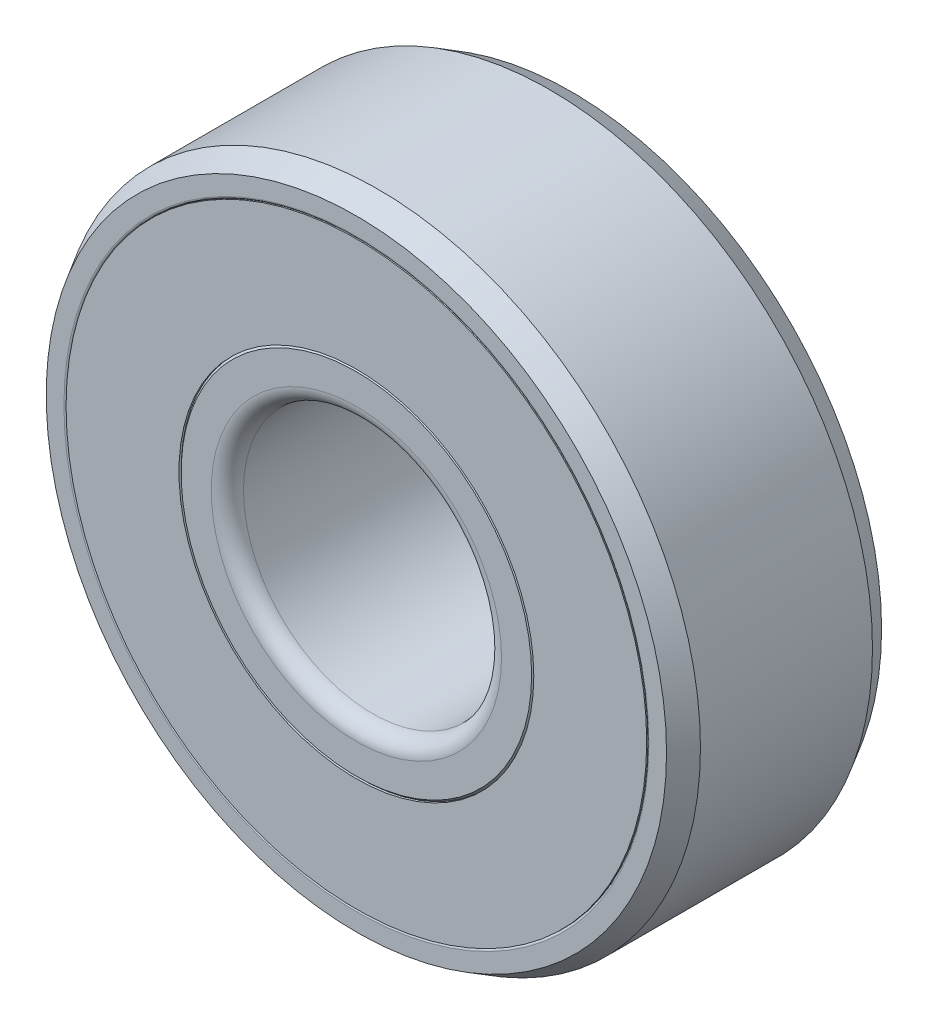
ISO-10303-21;
HEADER;
FILE_DESCRIPTION(('STEP AP214'),'2;1');
FILE_NAME('part.step','',(''),(''),'','','');
FILE_SCHEMA(('AUTOMOTIVE_DESIGN { 1 0 10303 214 1 1 1 1 }'));
ENDSEC;
DATA;
#1=APPLICATION_CONTEXT('core data for automotive mechanical design processes');
#2=APPLICATION_PROTOCOL_DEFINITION('international standard','automotive_design',2000,#1);
#3=PRODUCT_CONTEXT('',#1,'mechanical');
#4=PRODUCT('Part','Part','',(#3));
#5=PRODUCT_RELATED_PRODUCT_CATEGORY('part','',(#4));
#6=PRODUCT_DEFINITION_FORMATION('','',#4);
#7=PRODUCT_DEFINITION_CONTEXT('part definition',#1,'design');
#8=PRODUCT_DEFINITION('design','',#6,#7);
#9=PRODUCT_DEFINITION_SHAPE('','',#8);
#10=(LENGTH_UNIT() NAMED_UNIT(*) SI_UNIT(.MILLI.,.METRE.));
#11=(NAMED_UNIT(*) PLANE_ANGLE_UNIT() SI_UNIT($,.RADIAN.));
#12=(NAMED_UNIT(*) SI_UNIT($,.STERADIAN.) SOLID_ANGLE_UNIT());
#13=UNCERTAINTY_MEASURE_WITH_UNIT(LENGTH_MEASURE(1.E-05),#10,'distance_accuracy_value','');
#14=(GEOMETRIC_REPRESENTATION_CONTEXT(3) GLOBAL_UNCERTAINTY_ASSIGNED_CONTEXT((#13)) GLOBAL_UNIT_ASSIGNED_CONTEXT((#10,
#11,#12)) REPRESENTATION_CONTEXT('',''));
#15=CARTESIAN_POINT('',(0.,0.,0.));
#16=DIRECTION('',(0.,0.,1.));
#17=DIRECTION('',(1.,0.,0.));
#18=AXIS2_PLACEMENT_3D('',#15,#16,#17);
#19=CARTESIAN_POINT('',(4.25120868591987,-3.39022579760692,0.));
#20=DIRECTION('',(-0.781831482468022,0.623489801858743,0.));
#21=DIRECTION('',(0.,0.,-1.));
#22=AXIS2_PLACEMENT_3D('',#19,#20,#21);
#23=SPHERICAL_SURFACE('',#22,1.8125);
#24=CARTESIAN_POINT('',(2.83413912394658,-2.26015053173794,0.));
#25=VERTEX_POINT('',#24);
#26=VERTEX_LOOP('',#25);
#27=FACE_BOUND('',#26,.T.);
#28=ADVANCED_FACE('F42',(#27),#23,.T.);
#29=CLOSED_SHELL('',(#28));
#30=MANIFOLD_SOLID_BREP('B2',#29);
#31=CARTESIAN_POINT('',(5.30117052248868,1.20995757838741,0.));
#32=DIRECTION('',(-0.974927912181826,-0.222520933956305,0.));
#33=DIRECTION('',(0.,0.,-1.));
#34=AXIS2_PLACEMENT_3D('',#31,#32,#33);
#35=SPHERICAL_SURFACE('',#34,1.8125);
#36=CARTESIAN_POINT('',(3.53411368165912,0.806638385591606,0.));
#37=VERTEX_POINT('',#36);
#38=VERTEX_LOOP('',#37);
#39=FACE_BOUND('',#38,.T.);
#40=ADVANCED_FACE('F63',(#39),#35,.T.);
#41=CLOSED_SHELL('',(#40));
#42=MANIFOLD_SOLID_BREP('B6',#41);
#43=CARTESIAN_POINT('',(2.35924283145176,4.89901821921939,0.));
#44=DIRECTION('',(-0.433883739117565,-0.900968867902416,0.));
#45=DIRECTION('',(0.,0.,-1.));
#46=AXIS2_PLACEMENT_3D('',#43,#44,#45);
#47=SPHERICAL_SURFACE('',#46,1.8125);
#48=CARTESIAN_POINT('',(1.57282855430117,3.26601214614626,0.));
#49=VERTEX_POINT('',#48);
#50=VERTEX_LOOP('',#49);
#51=FACE_BOUND('',#50,.T.);
#52=ADVANCED_FACE('F84',(#51),#47,.T.);
#53=CLOSED_SHELL('',(#52));
#54=MANIFOLD_SOLID_BREP('B38',#53);
#55=CARTESIAN_POINT('',(-2.35924283145169,4.89901821921942,0.));
#56=DIRECTION('',(0.433883739117553,-0.900968867902422,0.));
#57=DIRECTION('',(0.,0.,-1.));
#58=AXIS2_PLACEMENT_3D('',#55,#56,#57);
#59=SPHERICAL_SURFACE('',#58,1.8125);
#60=CARTESIAN_POINT('',(-1.57282855430113,3.26601214614628,0.));
#61=VERTEX_POINT('',#60);
#62=VERTEX_LOOP('',#61);
#63=FACE_BOUND('',#62,.T.);
#64=ADVANCED_FACE('F105',(#63),#59,.T.);
#65=CLOSED_SHELL('',(#64));
#66=MANIFOLD_SOLID_BREP('B59',#65);
#67=CARTESIAN_POINT('',(-5.30117052248866,1.20995757838748,0.));
#68=DIRECTION('',(0.974927912181823,-0.222520933956318,0.));
#69=DIRECTION('',(0.,0.,-1.));
#70=AXIS2_PLACEMENT_3D('',#67,#68,#69);
#71=SPHERICAL_SURFACE('',#70,1.8125);
#72=CARTESIAN_POINT('',(-3.53411368165911,0.806638385591654,0.));
#73=VERTEX_POINT('',#72);
#74=VERTEX_LOOP('',#73);
#75=FACE_BOUND('',#74,.T.);
#76=ADVANCED_FACE('F126',(#75),#71,.T.);
#77=CLOSED_SHELL('',(#76));
#78=MANIFOLD_SOLID_BREP('B80',#77);
#79=CARTESIAN_POINT('',(-4.25120868591992,-3.39022579760686,0.));
#80=DIRECTION('',(0.781831482468031,0.623489801858732,0.));
#81=DIRECTION('',(0.,0.,-1.));
#82=AXIS2_PLACEMENT_3D('',#79,#80,#81);
#83=SPHERICAL_SURFACE('',#82,1.8125);
#84=CARTESIAN_POINT('',(-2.83413912394661,-2.2601505317379,0.));
#85=VERTEX_POINT('',#84);
#86=VERTEX_LOOP('',#85);
#87=FACE_BOUND('',#86,.T.);
#88=ADVANCED_FACE('F147',(#87),#83,.T.);
#89=CLOSED_SHELL('',(#88));
#90=MANIFOLD_SOLID_BREP('B101',#89);
#91=CARTESIAN_POINT('',(0.,-5.4375,0.));
#92=DIRECTION('',(0.,1.,0.));
#93=DIRECTION('',(0.,0.,-1.));
#94=AXIS2_PLACEMENT_3D('',#91,#92,#93);
#95=SPHERICAL_SURFACE('',#94,1.8125);
#96=CARTESIAN_POINT('',(0.,-3.625,0.));
#97=VERTEX_POINT('',#96);
#98=VERTEX_LOOP('',#97);
#99=FACE_BOUND('',#98,.T.);
#100=ADVANCED_FACE('F170',(#99),#95,.T.);
#101=CLOSED_SHELL('',(#100));
#102=MANIFOLD_SOLID_BREP('B122',#101);
#103=CARTESIAN_POINT('',(0.,-4.125,2.5));
#104=DIRECTION('',(0.,0.,1.));
#105=DIRECTION('',(1.,0.,0.));
#106=AXIS2_PLACEMENT_3D('',#103,#104,#105);
#107=PLANE('',#106);
#108=CARTESIAN_POINT('',(0.,0.,2.5));
#109=DIRECTION('',(0.,0.,1.));
#110=DIRECTION('',(1.,0.,0.));
#111=AXIS2_PLACEMENT_3D('',#108,#109,#110);
#112=CIRCLE('',#111,6.75);
#113=CARTESIAN_POINT('',(6.75,0.,2.5));
#114=VERTEX_POINT('',#113);
#115=EDGE_CURVE('E169',#114,#114,#112,.T.);
#116=ORIENTED_EDGE('',*,*,#115,.T.);
#117=EDGE_LOOP('',(#116));
#118=FACE_BOUND('',#117,.T.);
#119=CARTESIAN_POINT('',(0.,0.,2.5));
#120=DIRECTION('',(0.,0.,1.));
#121=DIRECTION('',(1.,0.,0.));
#122=AXIS2_PLACEMENT_3D('',#119,#120,#121);
#123=CIRCLE('',#122,4.125);
#124=CARTESIAN_POINT('',(4.125,0.,2.5));
#125=VERTEX_POINT('',#124);
#126=EDGE_CURVE('E207',#125,#125,#123,.T.);
#127=ORIENTED_EDGE('',*,*,#126,.F.);
#128=EDGE_LOOP('',(#127));
#129=FACE_BOUND('',#128,.T.);
#130=ADVANCED_FACE('F193',(#118,#129),#107,.T.);
#131=CARTESIAN_POINT('',(0.,0.,2.5));
#132=DIRECTION('',(0.,0.,1.));
#133=DIRECTION('',(1.,0.,0.));
#134=AXIS2_PLACEMENT_3D('',#131,#132,#133);
#135=CYLINDRICAL_SURFACE('',#134,6.75);
#136=CARTESIAN_POINT('',(0.,0.,1.984375));
#137=DIRECTION('',(0.,0.,1.));
#138=DIRECTION('',(1.,0.,0.));
#139=AXIS2_PLACEMENT_3D('',#136,#137,#138);
#140=CIRCLE('',#139,6.75);
#141=CARTESIAN_POINT('',(6.75,0.,1.984375));
#142=VERTEX_POINT('',#141);
#143=EDGE_CURVE('E199',#142,#142,#140,.T.);
#144=ORIENTED_EDGE('',*,*,#143,.T.);
#145=EDGE_LOOP('',(#144));
#146=FACE_BOUND('',#145,.T.);
#147=ORIENTED_EDGE('',*,*,#115,.F.);
#148=EDGE_LOOP('',(#147));
#149=FACE_BOUND('',#148,.T.);
#150=ADVANCED_FACE('F217',(#146,#149),#135,.T.);
#151=CARTESIAN_POINT('',(0.,-4.125,1.984375));
#152=DIRECTION('',(0.,0.,-1.));
#153=DIRECTION('',(-1.,0.,0.));
#154=AXIS2_PLACEMENT_3D('',#151,#152,#153);
#155=PLANE('',#154);
#156=CARTESIAN_POINT('',(0.,0.,1.984375));
#157=DIRECTION('',(0.,0.,1.));
#158=DIRECTION('',(1.,0.,0.));
#159=AXIS2_PLACEMENT_3D('',#156,#157,#158);
#160=CIRCLE('',#159,4.125);
#161=CARTESIAN_POINT('',(4.125,0.,1.984375));
#162=VERTEX_POINT('',#161);
#163=EDGE_CURVE('E203',#162,#162,#160,.T.);
#164=ORIENTED_EDGE('',*,*,#163,.T.);
#165=EDGE_LOOP('',(#164));
#166=FACE_BOUND('',#165,.T.);
#167=ORIENTED_EDGE('',*,*,#143,.F.);
#168=EDGE_LOOP('',(#167));
#169=FACE_BOUND('',#168,.T.);
#170=ADVANCED_FACE('F221',(#166,#169),#155,.T.);
#171=CARTESIAN_POINT('',(0.,0.,2.5));
#172=DIRECTION('',(0.,0.,1.));
#173=DIRECTION('',(1.,0.,0.));
#174=AXIS2_PLACEMENT_3D('',#171,#172,#173);
#175=CYLINDRICAL_SURFACE('',#174,4.125);
#176=ORIENTED_EDGE('',*,*,#126,.T.);
#177=EDGE_LOOP('',(#176));
#178=FACE_BOUND('',#177,.T.);
#179=ORIENTED_EDGE('',*,*,#163,.F.);
#180=EDGE_LOOP('',(#179));
#181=FACE_BOUND('',#180,.T.);
#182=ADVANCED_FACE('F213',(#178,#181),#175,.F.);
#183=CLOSED_SHELL('',(#130,#150,#170,#182));
#184=MANIFOLD_SOLID_BREP('B143',#183);
#185=CARTESIAN_POINT('',(0.,0.,2.125));
#186=DIRECTION('',(0.,0.,1.));
#187=DIRECTION('',(1.,0.,0.));
#188=AXIS2_PLACEMENT_3D('',#185,#186,#187);
#189=TOROIDAL_SURFACE('',#188,3.375,0.375);
#190=CARTESIAN_POINT('',(0.,0.,2.5));
#191=DIRECTION('',(0.,0.,1.));
#192=DIRECTION('',(1.,0.,0.));
#193=AXIS2_PLACEMENT_3D('',#190,#191,#192);
#194=CIRCLE('',#193,3.375);
#195=CARTESIAN_POINT('',(3.375,0.,2.5));
#196=VERTEX_POINT('',#195);
#197=EDGE_CURVE('E192',#196,#196,#194,.T.);
#198=ORIENTED_EDGE('',*,*,#197,.T.);
#199=EDGE_LOOP('',(#198));
#200=FACE_BOUND('',#199,.T.);
#201=CARTESIAN_POINT('',(0.,0.,2.125));
#202=DIRECTION('',(0.,0.,1.));
#203=DIRECTION('',(1.,0.,0.));
#204=AXIS2_PLACEMENT_3D('',#201,#202,#203);
#205=CIRCLE('',#204,3.);
#206=CARTESIAN_POINT('',(3.,0.,2.125));
#207=VERTEX_POINT('',#206);
#208=EDGE_CURVE('E298',#207,#207,#205,.T.);
#209=ORIENTED_EDGE('',*,*,#208,.F.);
#210=EDGE_LOOP('',(#209));
#211=FACE_BOUND('',#210,.T.);
#212=ADVANCED_FACE('F264',(#200,#211),#189,.T.);
#213=CARTESIAN_POINT('',(0.,-4.075,2.5));
#214=DIRECTION('',(0.,0.,1.));
#215=DIRECTION('',(1.,0.,0.));
#216=AXIS2_PLACEMENT_3D('',#213,#214,#215);
#217=PLANE('',#216);
#218=CARTESIAN_POINT('',(0.,0.,2.5));
#219=DIRECTION('',(0.,0.,1.));
#220=DIRECTION('',(1.,0.,0.));
#221=AXIS2_PLACEMENT_3D('',#218,#219,#220);
#222=CIRCLE('',#221,4.075);
#223=CARTESIAN_POINT('',(4.075,0.,2.5));
#224=VERTEX_POINT('',#223);
#225=EDGE_CURVE('E270',#224,#224,#222,.T.);
#226=ORIENTED_EDGE('',*,*,#225,.T.);
#227=EDGE_LOOP('',(#226));
#228=FACE_BOUND('',#227,.T.);
#229=ORIENTED_EDGE('',*,*,#197,.F.);
#230=EDGE_LOOP('',(#229));
#231=FACE_BOUND('',#230,.T.);
#232=ADVANCED_FACE('F306',(#228,#231),#217,.T.);
#233=CARTESIAN_POINT('',(0.,0.,2.5));
#234=DIRECTION('',(0.,0.,-1.));
#235=DIRECTION('',(-1.,0.,0.));
#236=AXIS2_PLACEMENT_3D('',#233,#234,#235);
#237=CONICAL_SURFACE('',#236,4.075,0.785398163397453);
#238=CARTESIAN_POINT('',(0.,0.,2.45));
#239=DIRECTION('',(0.,0.,1.));
#240=DIRECTION('',(1.,0.,0.));
#241=AXIS2_PLACEMENT_3D('',#238,#239,#240);
#242=CIRCLE('',#241,4.125);
#243=CARTESIAN_POINT('',(4.125,0.,2.45));
#244=VERTEX_POINT('',#243);
#245=EDGE_CURVE('E274',#244,#244,#242,.T.);
#246=ORIENTED_EDGE('',*,*,#245,.T.);
#247=EDGE_LOOP('',(#246));
#248=FACE_BOUND('',#247,.T.);
#249=ORIENTED_EDGE('',*,*,#225,.F.);
#250=EDGE_LOOP('',(#249));
#251=FACE_BOUND('',#250,.T.);
#252=ADVANCED_FACE('F310',(#248,#251),#237,.T.);
#253=CARTESIAN_POINT('',(0.,0.,2.5));
#254=DIRECTION('',(0.,0.,1.));
#255=DIRECTION('',(1.,0.,0.));
#256=AXIS2_PLACEMENT_3D('',#253,#254,#255);
#257=CYLINDRICAL_SURFACE('',#256,4.125);
#258=CARTESIAN_POINT('',(0.,0.,1.25));
#259=DIRECTION('',(0.,0.,1.));
#260=DIRECTION('',(1.,0.,0.));
#261=AXIS2_PLACEMENT_3D('',#258,#259,#260);
#262=CIRCLE('',#261,4.125);
#263=CARTESIAN_POINT('',(4.125,0.,1.25));
#264=VERTEX_POINT('',#263);
#265=EDGE_CURVE('E278',#264,#264,#262,.T.);
#266=ORIENTED_EDGE('',*,*,#265,.T.);
#267=EDGE_LOOP('',(#266));
#268=FACE_BOUND('',#267,.T.);
#269=ORIENTED_EDGE('',*,*,#245,.F.);
#270=EDGE_LOOP('',(#269));
#271=FACE_BOUND('',#270,.T.);
#272=ADVANCED_FACE('F314',(#268,#271),#257,.T.);
#273=CARTESIAN_POINT('',(0.,0.,0.));
#274=DIRECTION('',(0.,0.,1.));
#275=DIRECTION('',(1.,0.,0.));
#276=AXIS2_PLACEMENT_3D('',#273,#274,#275);
#277=TOROIDAL_SURFACE('',#276,5.4375,1.8125);
#278=CARTESIAN_POINT('',(0.,0.,-1.25));
#279=DIRECTION('',(0.,0.,1.));
#280=DIRECTION('',(1.,0.,0.));
#281=AXIS2_PLACEMENT_3D('',#278,#279,#280);
#282=CIRCLE('',#281,4.125);
#283=CARTESIAN_POINT('',(4.125,0.,-1.25));
#284=VERTEX_POINT('',#283);
#285=EDGE_CURVE('E283',#284,#284,#282,.T.);
#286=ORIENTED_EDGE('',*,*,#285,.T.);
#287=EDGE_LOOP('',(#286));
#288=FACE_BOUND('',#287,.T.);
#289=ORIENTED_EDGE('',*,*,#265,.F.);
#290=EDGE_LOOP('',(#289));
#291=FACE_BOUND('',#290,.T.);
#292=ADVANCED_FACE('F321',(#288,#291),#277,.F.);
#293=CARTESIAN_POINT('',(0.,0.,2.5));
#294=DIRECTION('',(0.,0.,1.));
#295=DIRECTION('',(1.,0.,0.));
#296=AXIS2_PLACEMENT_3D('',#293,#294,#295);
#297=CYLINDRICAL_SURFACE('',#296,4.125);
#298=CARTESIAN_POINT('',(0.,0.,-2.45));
#299=DIRECTION('',(0.,0.,1.));
#300=DIRECTION('',(1.,0.,0.));
#301=AXIS2_PLACEMENT_3D('',#298,#299,#300);
#302=CIRCLE('',#301,4.125);
#303=CARTESIAN_POINT('',(4.125,0.,-2.45));
#304=VERTEX_POINT('',#303);
#305=EDGE_CURVE('E286',#304,#304,#302,.T.);
#306=ORIENTED_EDGE('',*,*,#305,.T.);
#307=EDGE_LOOP('',(#306));
#308=FACE_BOUND('',#307,.T.);
#309=ORIENTED_EDGE('',*,*,#285,.F.);
#310=EDGE_LOOP('',(#309));
#311=FACE_BOUND('',#310,.T.);
#312=ADVANCED_FACE('F325',(#308,#311),#297,.T.);
#313=CARTESIAN_POINT('',(0.,0.,-2.45));
#314=DIRECTION('',(0.,0.,1.));
#315=DIRECTION('',(1.,0.,0.));
#316=AXIS2_PLACEMENT_3D('',#313,#314,#315);
#317=CONICAL_SURFACE('',#316,4.125,0.785398163397448);
#318=CARTESIAN_POINT('',(0.,0.,-2.5));
#319=DIRECTION('',(0.,0.,1.));
#320=DIRECTION('',(1.,0.,0.));
#321=AXIS2_PLACEMENT_3D('',#318,#319,#320);
#322=CIRCLE('',#321,4.075);
#323=CARTESIAN_POINT('',(4.075,0.,-2.5));
#324=VERTEX_POINT('',#323);
#325=EDGE_CURVE('E289',#324,#324,#322,.T.);
#326=ORIENTED_EDGE('',*,*,#325,.T.);
#327=EDGE_LOOP('',(#326));
#328=FACE_BOUND('',#327,.T.);
#329=ORIENTED_EDGE('',*,*,#305,.F.);
#330=EDGE_LOOP('',(#329));
#331=FACE_BOUND('',#330,.T.);
#332=ADVANCED_FACE('F329',(#328,#331),#317,.T.);
#333=CARTESIAN_POINT('',(0.,-4.075,-2.5));
#334=DIRECTION('',(0.,0.,-1.));
#335=DIRECTION('',(-1.,0.,0.));
#336=AXIS2_PLACEMENT_3D('',#333,#334,#335);
#337=PLANE('',#336);
#338=CARTESIAN_POINT('',(0.,0.,-2.5));
#339=DIRECTION('',(0.,0.,1.));
#340=DIRECTION('',(1.,0.,0.));
#341=AXIS2_PLACEMENT_3D('',#338,#339,#340);
#342=CIRCLE('',#341,3.375);
#343=CARTESIAN_POINT('',(3.375,0.,-2.5));
#344=VERTEX_POINT('',#343);
#345=EDGE_CURVE('E292',#344,#344,#342,.T.);
#346=ORIENTED_EDGE('',*,*,#345,.T.);
#347=EDGE_LOOP('',(#346));
#348=FACE_BOUND('',#347,.T.);
#349=ORIENTED_EDGE('',*,*,#325,.F.);
#350=EDGE_LOOP('',(#349));
#351=FACE_BOUND('',#350,.T.);
#352=ADVANCED_FACE('F333',(#348,#351),#337,.T.);
#353=CARTESIAN_POINT('',(0.,0.,-2.125));
#354=DIRECTION('',(0.,0.,1.));
#355=DIRECTION('',(1.,0.,0.));
#356=AXIS2_PLACEMENT_3D('',#353,#354,#355);
#357=TOROIDAL_SURFACE('',#356,3.375,0.375);
#358=CARTESIAN_POINT('',(0.,0.,-2.125));
#359=DIRECTION('',(0.,0.,1.));
#360=DIRECTION('',(1.,0.,0.));
#361=AXIS2_PLACEMENT_3D('',#358,#359,#360);
#362=CIRCLE('',#361,3.);
#363=CARTESIAN_POINT('',(3.,0.,-2.125));
#364=VERTEX_POINT('',#363);
#365=EDGE_CURVE('E295',#364,#364,#362,.T.);
#366=ORIENTED_EDGE('',*,*,#365,.T.);
#367=EDGE_LOOP('',(#366));
#368=FACE_BOUND('',#367,.T.);
#369=ORIENTED_EDGE('',*,*,#345,.F.);
#370=EDGE_LOOP('',(#369));
#371=FACE_BOUND('',#370,.T.);
#372=ADVANCED_FACE('F337',(#368,#371),#357,.T.);
#373=CARTESIAN_POINT('',(0.,0.,2.5));
#374=DIRECTION('',(0.,0.,1.));
#375=DIRECTION('',(1.,0.,0.));
#376=AXIS2_PLACEMENT_3D('',#373,#374,#375);
#377=CYLINDRICAL_SURFACE('',#376,3.);
#378=ORIENTED_EDGE('',*,*,#208,.T.);
#379=EDGE_LOOP('',(#378));
#380=FACE_BOUND('',#379,.T.);
#381=ORIENTED_EDGE('',*,*,#365,.F.);
#382=EDGE_LOOP('',(#381));
#383=FACE_BOUND('',#382,.T.);
#384=ADVANCED_FACE('F302',(#380,#383),#377,.F.);
#385=CLOSED_SHELL('',(#212,#232,#252,#272,#292,#312,#332,#352,#372,#384));
#386=MANIFOLD_SOLID_BREP('B164',#385);
#387=CARTESIAN_POINT('',(0.,0.,2.5));
#388=DIRECTION('',(0.,0.,-1.));
#389=DIRECTION('',(-1.,0.,0.));
#390=AXIS2_PLACEMENT_3D('',#387,#388,#389);
#391=CONICAL_SURFACE('',#390,7.2113248654052,0.523598775598276);
#392=CARTESIAN_POINT('',(0.,0.,2.));
#393=DIRECTION('',(0.,0.,1.));
#394=DIRECTION('',(1.,0.,0.));
#395=AXIS2_PLACEMENT_3D('',#392,#393,#394);
#396=CIRCLE('',#395,7.5);
#397=CARTESIAN_POINT('',(7.5,0.,2.));
#398=VERTEX_POINT('',#397);
#399=EDGE_CURVE('E263',#398,#398,#396,.T.);
#400=ORIENTED_EDGE('',*,*,#399,.T.);
#401=EDGE_LOOP('',(#400));
#402=FACE_BOUND('',#401,.T.);
#403=CARTESIAN_POINT('',(0.,0.,2.5));
#404=DIRECTION('',(0.,0.,1.));
#405=DIRECTION('',(1.,0.,0.));
#406=AXIS2_PLACEMENT_3D('',#403,#404,#405);
#407=CIRCLE('',#406,7.2113248654052);
#408=CARTESIAN_POINT('',(7.2113248654052,0.,2.5));
#409=VERTEX_POINT('',#408);
#410=EDGE_CURVE('E452',#409,#409,#407,.T.);
#411=ORIENTED_EDGE('',*,*,#410,.F.);
#412=EDGE_LOOP('',(#411));
#413=FACE_BOUND('',#412,.T.);
#414=ADVANCED_FACE('F418',(#402,#413),#391,.T.);
#415=CARTESIAN_POINT('',(0.,0.,2.5));
#416=DIRECTION('',(0.,0.,1.));
#417=DIRECTION('',(1.,0.,0.));
#418=AXIS2_PLACEMENT_3D('',#415,#416,#417);
#419=CYLINDRICAL_SURFACE('',#418,7.5);
#420=CARTESIAN_POINT('',(0.,0.,-2.));
#421=DIRECTION('',(0.,0.,1.));
#422=DIRECTION('',(1.,0.,0.));
#423=AXIS2_PLACEMENT_3D('',#420,#421,#422);
#424=CIRCLE('',#423,7.5);
#425=CARTESIAN_POINT('',(7.5,0.,-2.));
#426=VERTEX_POINT('',#425);
#427=EDGE_CURVE('E424',#426,#426,#424,.T.);
#428=ORIENTED_EDGE('',*,*,#427,.T.);
#429=EDGE_LOOP('',(#428));
#430=FACE_BOUND('',#429,.T.);
#431=ORIENTED_EDGE('',*,*,#399,.F.);
#432=EDGE_LOOP('',(#431));
#433=FACE_BOUND('',#432,.T.);
#434=ADVANCED_FACE('F460',(#430,#433),#419,.T.);
#435=CARTESIAN_POINT('',(0.,0.,-2.));
#436=DIRECTION('',(0.,0.,1.));
#437=DIRECTION('',(1.,0.,0.));
#438=AXIS2_PLACEMENT_3D('',#435,#436,#437);
#439=CONICAL_SURFACE('',#438,7.5,0.523598775598277);
#440=CARTESIAN_POINT('',(0.,0.,-2.5));
#441=DIRECTION('',(0.,0.,1.));
#442=DIRECTION('',(1.,0.,0.));
#443=AXIS2_PLACEMENT_3D('',#440,#441,#442);
#444=CIRCLE('',#443,7.2113248654052);
#445=CARTESIAN_POINT('',(7.2113248654052,0.,-2.5));
#446=VERTEX_POINT('',#445);
#447=EDGE_CURVE('E428',#446,#446,#444,.T.);
#448=ORIENTED_EDGE('',*,*,#447,.T.);
#449=EDGE_LOOP('',(#448));
#450=FACE_BOUND('',#449,.T.);
#451=ORIENTED_EDGE('',*,*,#427,.F.);
#452=EDGE_LOOP('',(#451));
#453=FACE_BOUND('',#452,.T.);
#454=ADVANCED_FACE('F464',(#450,#453),#439,.T.);
#455=CARTESIAN_POINT('',(0.,-6.8,-2.5));
#456=DIRECTION('',(0.,0.,-1.));
#457=DIRECTION('',(-1.,0.,0.));
#458=AXIS2_PLACEMENT_3D('',#455,#456,#457);
#459=PLANE('',#458);
#460=CARTESIAN_POINT('',(0.,0.,-2.5));
#461=DIRECTION('',(0.,0.,1.));
#462=DIRECTION('',(1.,0.,0.));
#463=AXIS2_PLACEMENT_3D('',#460,#461,#462);
#464=CIRCLE('',#463,6.8);
#465=CARTESIAN_POINT('',(6.8,0.,-2.5));
#466=VERTEX_POINT('',#465);
#467=EDGE_CURVE('E432',#466,#466,#464,.T.);
#468=ORIENTED_EDGE('',*,*,#467,.T.);
#469=EDGE_LOOP('',(#468));
#470=FACE_BOUND('',#469,.T.);
#471=ORIENTED_EDGE('',*,*,#447,.F.);
#472=EDGE_LOOP('',(#471));
#473=FACE_BOUND('',#472,.T.);
#474=ADVANCED_FACE('F468',(#470,#473),#459,.T.);
#475=CARTESIAN_POINT('',(0.,0.,-2.45));
#476=DIRECTION('',(0.,0.,1.));
#477=DIRECTION('',(1.,0.,0.));
#478=AXIS2_PLACEMENT_3D('',#475,#476,#477);
#479=TOROIDAL_SURFACE('',#478,6.8,0.0500000000000001);
#480=CARTESIAN_POINT('',(0.,0.,-2.45));
#481=DIRECTION('',(0.,0.,1.));
#482=DIRECTION('',(1.,0.,0.));
#483=AXIS2_PLACEMENT_3D('',#480,#481,#482);
#484=CIRCLE('',#483,6.75);
#485=CARTESIAN_POINT('',(6.75,0.,-2.45));
#486=VERTEX_POINT('',#485);
#487=EDGE_CURVE('E437',#486,#486,#484,.T.);
#488=ORIENTED_EDGE('',*,*,#487,.T.);
#489=EDGE_LOOP('',(#488));
#490=FACE_BOUND('',#489,.T.);
#491=ORIENTED_EDGE('',*,*,#467,.F.);
#492=EDGE_LOOP('',(#491));
#493=FACE_BOUND('',#492,.T.);
#494=ADVANCED_FACE('F475',(#490,#493),#479,.T.);
#495=CARTESIAN_POINT('',(0.,0.,2.5));
#496=DIRECTION('',(0.,0.,1.));
#497=DIRECTION('',(1.,0.,0.));
#498=AXIS2_PLACEMENT_3D('',#495,#496,#497);
#499=CYLINDRICAL_SURFACE('',#498,6.75);
#500=CARTESIAN_POINT('',(0.,0.,-1.25));
#501=DIRECTION('',(0.,0.,1.));
#502=DIRECTION('',(1.,0.,0.));
#503=AXIS2_PLACEMENT_3D('',#500,#501,#502);
#504=CIRCLE('',#503,6.75);
#505=CARTESIAN_POINT('',(6.75,0.,-1.25));
#506=VERTEX_POINT('',#505);
#507=EDGE_CURVE('E440',#506,#506,#504,.T.);
#508=ORIENTED_EDGE('',*,*,#507,.T.);
#509=EDGE_LOOP('',(#508));
#510=FACE_BOUND('',#509,.T.);
#511=ORIENTED_EDGE('',*,*,#487,.F.);
#512=EDGE_LOOP('',(#511));
#513=FACE_BOUND('',#512,.T.);
#514=ADVANCED_FACE('F479',(#510,#513),#499,.F.);
#515=CARTESIAN_POINT('',(0.,0.,0.));
#516=DIRECTION('',(0.,0.,1.));
#517=DIRECTION('',(1.,0.,0.));
#518=AXIS2_PLACEMENT_3D('',#515,#516,#517);
#519=TOROIDAL_SURFACE('',#518,5.4375,1.8125);
#520=CARTESIAN_POINT('',(0.,0.,1.25));
#521=DIRECTION('',(0.,0.,1.));
#522=DIRECTION('',(1.,0.,0.));
#523=AXIS2_PLACEMENT_3D('',#520,#521,#522);
#524=CIRCLE('',#523,6.75);
#525=CARTESIAN_POINT('',(6.75,0.,1.25));
#526=VERTEX_POINT('',#525);
#527=EDGE_CURVE('E443',#526,#526,#524,.T.);
#528=ORIENTED_EDGE('',*,*,#527,.T.);
#529=EDGE_LOOP('',(#528));
#530=FACE_BOUND('',#529,.T.);
#531=ORIENTED_EDGE('',*,*,#507,.F.);
#532=EDGE_LOOP('',(#531));
#533=FACE_BOUND('',#532,.T.);
#534=ADVANCED_FACE('F483',(#530,#533),#519,.F.);
#535=CARTESIAN_POINT('',(0.,0.,2.5));
#536=DIRECTION('',(0.,0.,1.));
#537=DIRECTION('',(1.,0.,0.));
#538=AXIS2_PLACEMENT_3D('',#535,#536,#537);
#539=CYLINDRICAL_SURFACE('',#538,6.75);
#540=CARTESIAN_POINT('',(0.,0.,2.45));
#541=DIRECTION('',(0.,0.,1.));
#542=DIRECTION('',(1.,0.,0.));
#543=AXIS2_PLACEMENT_3D('',#540,#541,#542);
#544=CIRCLE('',#543,6.75);
#545=CARTESIAN_POINT('',(6.75,0.,2.45));
#546=VERTEX_POINT('',#545);
#547=EDGE_CURVE('E446',#546,#546,#544,.T.);
#548=ORIENTED_EDGE('',*,*,#547,.T.);
#549=EDGE_LOOP('',(#548));
#550=FACE_BOUND('',#549,.T.);
#551=ORIENTED_EDGE('',*,*,#527,.F.);
#552=EDGE_LOOP('',(#551));
#553=FACE_BOUND('',#552,.T.);
#554=ADVANCED_FACE('F487',(#550,#553),#539,.F.);
#555=CARTESIAN_POINT('',(0.,0.,2.45));
#556=DIRECTION('',(0.,0.,1.));
#557=DIRECTION('',(1.,0.,0.));
#558=AXIS2_PLACEMENT_3D('',#555,#556,#557);
#559=TOROIDAL_SURFACE('',#558,6.8,0.0500000000000001);
#560=CARTESIAN_POINT('',(0.,0.,2.5));
#561=DIRECTION('',(0.,0.,1.));
#562=DIRECTION('',(1.,0.,0.));
#563=AXIS2_PLACEMENT_3D('',#560,#561,#562);
#564=CIRCLE('',#563,6.8);
#565=CARTESIAN_POINT('',(6.8,0.,2.5));
#566=VERTEX_POINT('',#565);
#567=EDGE_CURVE('E449',#566,#566,#564,.T.);
#568=ORIENTED_EDGE('',*,*,#567,.T.);
#569=EDGE_LOOP('',(#568));
#570=FACE_BOUND('',#569,.T.);
#571=ORIENTED_EDGE('',*,*,#547,.F.);
#572=EDGE_LOOP('',(#571));
#573=FACE_BOUND('',#572,.T.);
#574=ADVANCED_FACE('F491',(#570,#573),#559,.T.);
#575=CARTESIAN_POINT('',(0.,-6.8,2.5));
#576=DIRECTION('',(0.,0.,1.));
#577=DIRECTION('',(1.,0.,0.));
#578=AXIS2_PLACEMENT_3D('',#575,#576,#577);
#579=PLANE('',#578);
#580=ORIENTED_EDGE('',*,*,#410,.T.);
#581=EDGE_LOOP('',(#580));
#582=FACE_BOUND('',#581,.T.);
#583=ORIENTED_EDGE('',*,*,#567,.F.);
#584=EDGE_LOOP('',(#583));
#585=FACE_BOUND('',#584,.T.);
#586=ADVANCED_FACE('F456',(#582,#585),#579,.T.);
#587=CLOSED_SHELL('',(#414,#434,#454,#474,#494,#514,#534,#554,#574,#586));
#588=MANIFOLD_SOLID_BREP('B187',#587);
#589=ADVANCED_BREP_SHAPE_REPRESENTATION('',(#18,#30,#42,#54,#66,#78,#90,#102,#184,#386,#588),#14);
#590=SHAPE_DEFINITION_REPRESENTATION(#9,#589);
ENDSEC;
END-ISO-10303-21;
